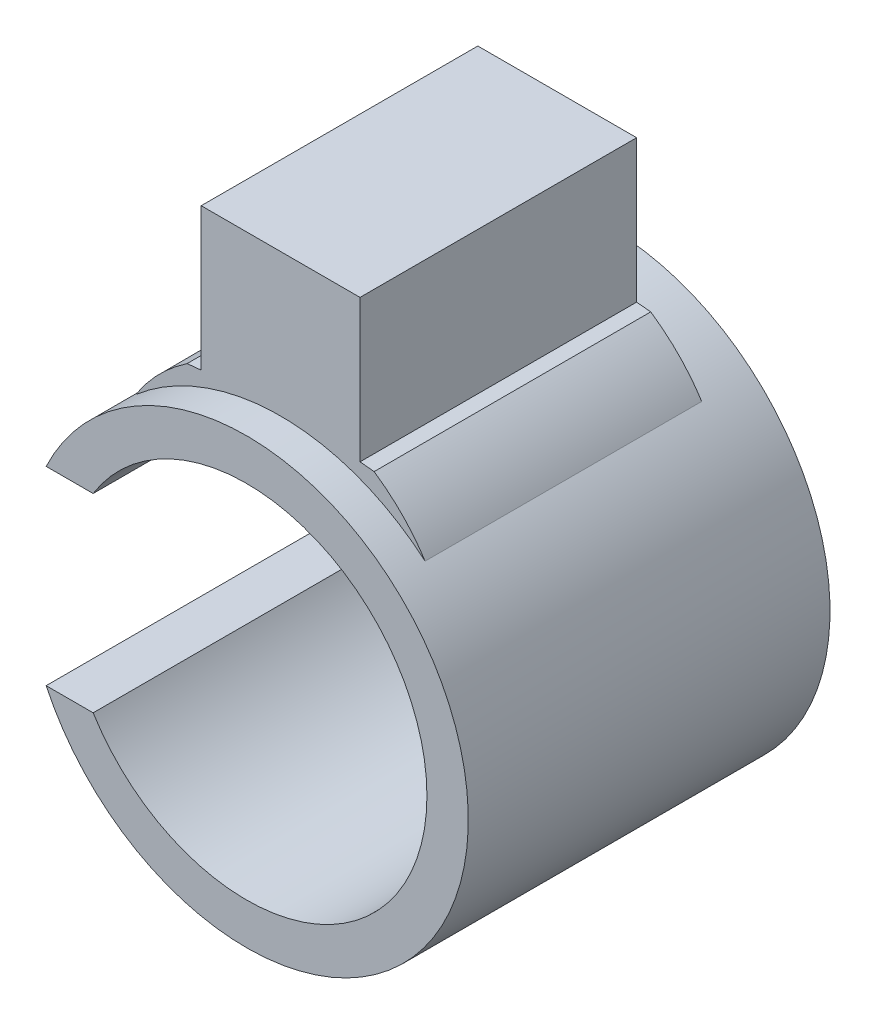
ISO-10303-21;
HEADER;
FILE_DESCRIPTION(('STEP AP214'),'2;1');
FILE_NAME('part.step','',(''),(''),'','','');
FILE_SCHEMA(('AUTOMOTIVE_DESIGN { 1 0 10303 214 1 1 1 1 }'));
ENDSEC;
DATA;
#1=APPLICATION_CONTEXT('core data for automotive mechanical design processes');
#2=APPLICATION_PROTOCOL_DEFINITION('international standard','automotive_design',2000,#1);
#3=PRODUCT_CONTEXT('',#1,'mechanical');
#4=PRODUCT('Part','Part','',(#3));
#5=PRODUCT_RELATED_PRODUCT_CATEGORY('part','',(#4));
#6=PRODUCT_DEFINITION_FORMATION('','',#4);
#7=PRODUCT_DEFINITION_CONTEXT('part definition',#1,'design');
#8=PRODUCT_DEFINITION('design','',#6,#7);
#9=PRODUCT_DEFINITION_SHAPE('','',#8);
#10=(LENGTH_UNIT() NAMED_UNIT(*) SI_UNIT(.MILLI.,.METRE.));
#11=(NAMED_UNIT(*) PLANE_ANGLE_UNIT() SI_UNIT($,.RADIAN.));
#12=(NAMED_UNIT(*) SI_UNIT($,.STERADIAN.) SOLID_ANGLE_UNIT());
#13=UNCERTAINTY_MEASURE_WITH_UNIT(LENGTH_MEASURE(1.E-05),#10,'distance_accuracy_value','');
#14=(GEOMETRIC_REPRESENTATION_CONTEXT(3) GLOBAL_UNCERTAINTY_ASSIGNED_CONTEXT((#13)) GLOBAL_UNIT_ASSIGNED_CONTEXT((#10,
#11,#12)) REPRESENTATION_CONTEXT('',''));
#15=CARTESIAN_POINT('',(0.,0.,0.));
#16=DIRECTION('',(0.,0.,1.));
#17=DIRECTION('',(1.,0.,0.));
#18=AXIS2_PLACEMENT_3D('',#15,#16,#17);
#19=CARTESIAN_POINT('',(0.,0.,-53.));
#20=DIRECTION('',(0.,0.,1.));
#21=DIRECTION('',(1.,0.,0.));
#22=AXIS2_PLACEMENT_3D('',#19,#20,#21);
#23=CYLINDRICAL_SURFACE('',#22,23.3557094180921);
#24=DIRECTION('',(0.,0.,-1.));
#25=VECTOR('',#24,1.);
#26=CARTESIAN_POINT('',(-15.2157622327974,17.7191913499835,-5.36257568087237));
#27=LINE('',#26,#25);
#28=CARTESIAN_POINT('',(-15.2157622327974,17.7191913499835,-21.5887815299654));
#29=VERTEX_POINT('',#28);
#30=CARTESIAN_POINT('',(-15.2157622327974,17.7191913499835,-50.7213614420877));
#31=VERTEX_POINT('',#30);
#32=EDGE_CURVE('E219',#29,#31,#27,.T.);
#33=ORIENTED_EDGE('',*,*,#32,.T.);
#34=CARTESIAN_POINT('',(0.,0.,-50.7213614420877));
#35=DIRECTION('',(0.,0.,-1.));
#36=DIRECTION('',(-1.,0.,0.));
#37=AXIS2_PLACEMENT_3D('',#34,#35,#36);
#38=CIRCLE('',#37,23.3557094180921);
#39=CARTESIAN_POINT('',(15.2157622327974,17.7191913499835,-50.7213614420877));
#40=VERTEX_POINT('',#39);
#41=EDGE_CURVE('E102',#31,#40,#38,.T.);
#42=ORIENTED_EDGE('',*,*,#41,.T.);
#43=DIRECTION('',(0.,0.,-1.));
#44=VECTOR('',#43,1.);
#45=CARTESIAN_POINT('',(15.2157622327974,17.7191913499835,-5.36257568087237));
#46=LINE('',#45,#44);
#47=CARTESIAN_POINT('',(15.2157622327974,17.7191913499835,-21.5887815299654));
#48=VERTEX_POINT('',#47);
#49=EDGE_CURVE('E299',#48,#40,#46,.T.);
#50=ORIENTED_EDGE('',*,*,#49,.F.);
#51=CARTESIAN_POINT('',(0.,0.,-21.5887815299654));
#52=DIRECTION('',(0.,0.,-1.));
#53=DIRECTION('',(-1.,0.,0.));
#54=AXIS2_PLACEMENT_3D('',#51,#52,#53);
#55=CIRCLE('',#54,23.3557094180921);
#56=EDGE_CURVE('E298',#48,#29,#55,.F.);
#57=ORIENTED_EDGE('',*,*,#56,.T.);
#58=EDGE_LOOP('',(#33,#42,#50,#57));
#59=FACE_BOUND('',#58,.T.);
#60=CARTESIAN_POINT('',(0.,0.,-18.));
#61=DIRECTION('',(0.,0.,1.));
#62=DIRECTION('',(1.,0.,0.));
#63=AXIS2_PLACEMENT_3D('',#60,#61,#62);
#64=CIRCLE('',#63,23.3557094180921);
#65=CARTESIAN_POINT('',(-21.1066141866087,-10.,-18.));
#66=VERTEX_POINT('',#65);
#67=CARTESIAN_POINT('',(-21.1066141866087,10.,-18.));
#68=VERTEX_POINT('',#67);
#69=EDGE_CURVE('E317',#66,#68,#64,.T.);
#70=ORIENTED_EDGE('',*,*,#69,.F.);
#71=DIRECTION('',(0.,0.,1.));
#72=VECTOR('',#71,1.);
#73=CARTESIAN_POINT('',(-21.1066141866087,-10.,-56.0968163326382));
#74=LINE('',#73,#72);
#75=CARTESIAN_POINT('',(-21.1066141866087,-10.,-56.0968163326382));
#76=VERTEX_POINT('',#75);
#77=EDGE_CURVE('E207',#76,#66,#74,.T.);
#78=ORIENTED_EDGE('',*,*,#77,.F.);
#79=CARTESIAN_POINT('',(0.,0.,-56.0968163326382));
#80=DIRECTION('',(0.,0.,1.));
#81=DIRECTION('',(1.,0.,0.));
#82=AXIS2_PLACEMENT_3D('',#79,#80,#81);
#83=CIRCLE('',#82,23.3557094180921);
#84=CARTESIAN_POINT('',(-21.1066141866087,10.,-56.0968163326382));
#85=VERTEX_POINT('',#84);
#86=EDGE_CURVE('E328',#76,#85,#83,.T.);
#87=ORIENTED_EDGE('',*,*,#86,.T.);
#88=DIRECTION('',(0.,0.,1.));
#89=VECTOR('',#88,1.);
#90=CARTESIAN_POINT('',(-21.1066141866087,10.,-56.0968163326382));
#91=LINE('',#90,#89);
#92=EDGE_CURVE('E184',#85,#68,#91,.T.);
#93=ORIENTED_EDGE('',*,*,#92,.T.);
#94=EDGE_LOOP('',(#70,#78,#87,#93));
#95=FACE_BOUND('',#94,.T.);
#96=ADVANCED_FACE('F79',(#59,#95),#23,.T.);
#97=CARTESIAN_POINT('',(0.,23.3557094180921,-56.0968163326382));
#98=DIRECTION('',(0.,0.,1.));
#99=DIRECTION('',(1.,0.,0.));
#100=AXIS2_PLACEMENT_3D('',#97,#98,#99);
#101=PLANE('',#100);
#102=CARTESIAN_POINT('',(0.,0.,-56.0968163326382));
#103=DIRECTION('',(0.,0.,-1.));
#104=DIRECTION('',(-1.,0.,0.));
#105=AXIS2_PLACEMENT_3D('',#102,#103,#104);
#106=CIRCLE('',#105,7.69210004054701);
#107=CARTESIAN_POINT('',(-7.69210004054701,0.,-56.0968163326382));
#108=VERTEX_POINT('',#107);
#109=EDGE_CURVE('E309',#108,#108,#106,.T.);
#110=ORIENTED_EDGE('',*,*,#109,.F.);
#111=EDGE_LOOP('',(#110));
#112=FACE_BOUND('',#111,.T.);
#113=ORIENTED_EDGE('',*,*,#86,.F.);
#114=DIRECTION('',(1.,0.,0.));
#115=VECTOR('',#114,1.);
#116=CARTESIAN_POINT('',(-16.1554944214035,-10.,-56.0968163326382));
#117=LINE('',#116,#115);
#118=CARTESIAN_POINT('',(-16.1554944214035,-10.,-56.0968163326382));
#119=VERTEX_POINT('',#118);
#120=EDGE_CURVE('E194',#76,#119,#117,.T.);
#121=ORIENTED_EDGE('',*,*,#120,.T.);
#122=CARTESIAN_POINT('',(0.,0.,-56.0968163326382));
#123=DIRECTION('',(0.,0.,-1.));
#124=DIRECTION('',(1.,0.,0.));
#125=AXIS2_PLACEMENT_3D('',#122,#123,#124);
#126=CIRCLE('',#125,19.);
#127=CARTESIAN_POINT('',(-16.1554944214035,10.,-56.0968163326382));
#128=VERTEX_POINT('',#127);
#129=EDGE_CURVE('E179',#119,#128,#126,.T.);
#130=ORIENTED_EDGE('',*,*,#129,.T.);
#131=DIRECTION('',(-1.,0.,0.));
#132=VECTOR('',#131,1.);
#133=CARTESIAN_POINT('',(-16.1554944214035,10.,-56.0968163326382));
#134=LINE('',#133,#132);
#135=EDGE_CURVE('E187',#128,#85,#134,.T.);
#136=ORIENTED_EDGE('',*,*,#135,.T.);
#137=EDGE_LOOP('',(#113,#121,#130,#136));
#138=FACE_BOUND('',#137,.T.);
#139=ADVANCED_FACE('F196',(#112,#138),#101,.F.);
#140=CARTESIAN_POINT('',(0.,19.,-53.));
#141=DIRECTION('',(0.,0.,-1.));
#142=DIRECTION('',(-1.,0.,0.));
#143=AXIS2_PLACEMENT_3D('',#140,#141,#142);
#144=PLANE('',#143);
#145=CARTESIAN_POINT('',(0.,0.,-53.));
#146=DIRECTION('',(0.,0.,-1.));
#147=DIRECTION('',(-1.,0.,0.));
#148=AXIS2_PLACEMENT_3D('',#145,#146,#147);
#149=CIRCLE('',#148,7.69210004054701);
#150=CARTESIAN_POINT('',(-7.69210004054701,0.,-53.));
#151=VERTEX_POINT('',#150);
#152=EDGE_CURVE('E316',#151,#151,#149,.T.);
#153=ORIENTED_EDGE('',*,*,#152,.T.);
#154=EDGE_LOOP('',(#153));
#155=FACE_BOUND('',#154,.T.);
#156=CARTESIAN_POINT('',(0.,0.,-53.));
#157=DIRECTION('',(0.,0.,1.));
#158=DIRECTION('',(1.,0.,0.));
#159=AXIS2_PLACEMENT_3D('',#156,#157,#158);
#160=CIRCLE('',#159,19.);
#161=CARTESIAN_POINT('',(-16.1554944214035,10.,-53.));
#162=VERTEX_POINT('',#161);
#163=CARTESIAN_POINT('',(-16.1554944214035,-10.,-53.));
#164=VERTEX_POINT('',#163);
#165=EDGE_CURVE('E182',#162,#164,#160,.T.);
#166=ORIENTED_EDGE('',*,*,#165,.T.);
#167=EDGE_CURVE('E325',#164,#162,#160,.T.);
#168=ORIENTED_EDGE('',*,*,#167,.T.);
#169=EDGE_LOOP('',(#166,#168));
#170=FACE_BOUND('',#169,.T.);
#171=ADVANCED_FACE('F395',(#155,#170),#144,.F.);
#172=CARTESIAN_POINT('',(0.,0.,-53.));
#173=DIRECTION('',(0.,0.,1.));
#174=DIRECTION('',(1.,0.,0.));
#175=AXIS2_PLACEMENT_3D('',#172,#173,#174);
#176=CYLINDRICAL_SURFACE('',#175,19.);
#177=ORIENTED_EDGE('',*,*,#167,.F.);
#178=DIRECTION('',(0.,0.,1.));
#179=VECTOR('',#178,1.);
#180=CARTESIAN_POINT('',(-16.1554944214035,-10.,-56.0968163326382));
#181=LINE('',#180,#179);
#182=CARTESIAN_POINT('',(-16.1554944214035,-10.,-18.));
#183=VERTEX_POINT('',#182);
#184=EDGE_CURVE('E206',#164,#183,#181,.T.);
#185=ORIENTED_EDGE('',*,*,#184,.T.);
#186=CARTESIAN_POINT('',(0.,0.,-18.));
#187=DIRECTION('',(0.,0.,1.));
#188=DIRECTION('',(1.,0.,0.));
#189=AXIS2_PLACEMENT_3D('',#186,#187,#188);
#190=CIRCLE('',#189,19.);
#191=CARTESIAN_POINT('',(-16.1554944214035,10.,-18.));
#192=VERTEX_POINT('',#191);
#193=EDGE_CURVE('E321',#183,#192,#190,.T.);
#194=ORIENTED_EDGE('',*,*,#193,.T.);
#195=DIRECTION('',(0.,0.,1.));
#196=VECTOR('',#195,1.);
#197=CARTESIAN_POINT('',(-16.1554944214035,10.,-56.0968163326382));
#198=LINE('',#197,#196);
#199=EDGE_CURVE('E94',#162,#192,#198,.T.);
#200=ORIENTED_EDGE('',*,*,#199,.F.);
#201=EDGE_LOOP('',(#177,#185,#194,#200));
#202=FACE_BOUND('',#201,.T.);
#203=ADVANCED_FACE('F341',(#202),#176,.F.);
#204=CARTESIAN_POINT('',(0.,19.,-18.));
#205=DIRECTION('',(0.,0.,-1.));
#206=DIRECTION('',(-1.,0.,0.));
#207=AXIS2_PLACEMENT_3D('',#204,#205,#206);
#208=PLANE('',#207);
#209=ORIENTED_EDGE('',*,*,#193,.F.);
#210=DIRECTION('',(-1.,0.,0.));
#211=VECTOR('',#210,1.);
#212=CARTESIAN_POINT('',(0.,-9.99999999999999,-18.));
#213=LINE('',#212,#211);
#214=EDGE_CURVE('E12',#183,#66,#213,.T.);
#215=ORIENTED_EDGE('',*,*,#214,.T.);
#216=ORIENTED_EDGE('',*,*,#69,.T.);
#217=DIRECTION('',(1.,0.,0.));
#218=VECTOR('',#217,1.);
#219=CARTESIAN_POINT('',(0.,10.,-18.));
#220=LINE('',#219,#218);
#221=EDGE_CURVE('E87',#68,#192,#220,.T.);
#222=ORIENTED_EDGE('',*,*,#221,.T.);
#223=EDGE_LOOP('',(#209,#215,#216,#222));
#224=FACE_BOUND('',#223,.T.);
#225=ADVANCED_FACE('F336',(#224),#208,.F.);
#226=CARTESIAN_POINT('',(0.,0.,-46.0968163326382));
#227=DIRECTION('',(0.,0.,-1.));
#228=DIRECTION('',(-1.,0.,0.));
#229=AXIS2_PLACEMENT_3D('',#226,#227,#228);
#230=CYLINDRICAL_SURFACE('',#229,7.69210004054701);
#231=ORIENTED_EDGE('',*,*,#109,.T.);
#232=EDGE_LOOP('',(#231));
#233=FACE_BOUND('',#232,.T.);
#234=ORIENTED_EDGE('',*,*,#152,.F.);
#235=EDGE_LOOP('',(#234));
#236=FACE_BOUND('',#235,.T.);
#237=ADVANCED_FACE('F444',(#233,#236),#230,.F.);
#238=CARTESIAN_POINT('',(2.32398983291346,23.9418915673897,-5.36257568087237));
#239=DIRECTION('',(-0.0966138395780347,-0.995321940882441,0.));
#240=DIRECTION('',(0.995321940882441,-0.0966138395780347,0.));
#241=AXIS2_PLACEMENT_3D('',#238,#239,#240);
#242=PLANE('',#241);
#243=DIRECTION('',(0.,0.,-1.));
#244=VECTOR('',#243,1.);
#245=CARTESIAN_POINT('',(8.36287574302456,23.3557094180921,-5.36257568087237));
#246=LINE('',#245,#244);
#247=CARTESIAN_POINT('',(8.36287574302456,23.3557094180921,-21.5887815299654));
#248=VERTEX_POINT('',#247);
#249=CARTESIAN_POINT('',(8.36287574302456,23.3557094180921,-50.7213614420877));
#250=VERTEX_POINT('',#249);
#251=EDGE_CURVE('E294',#248,#250,#246,.T.);
#252=ORIENTED_EDGE('',*,*,#251,.F.);
#253=DIRECTION('',(0.995321940882441,-0.0966138395780347,0.));
#254=VECTOR('',#253,1.);
#255=CARTESIAN_POINT('',(2.32398983291346,23.9418915673897,-21.5887815299654));
#256=LINE('',#255,#254);
#257=CARTESIAN_POINT('',(9.85069403878302,23.2112899772625,-21.5887815299654));
#258=VERTEX_POINT('',#257);
#259=EDGE_CURVE('E273',#248,#258,#256,.T.);
#260=ORIENTED_EDGE('',*,*,#259,.T.);
#261=DIRECTION('',(0.,0.,-1.));
#262=VECTOR('',#261,1.);
#263=CARTESIAN_POINT('',(9.85069403878302,23.2112899772625,-5.36257568087237));
#264=LINE('',#263,#262);
#265=CARTESIAN_POINT('',(9.85069403878302,23.2112899772625,-50.7213614420877));
#266=VERTEX_POINT('',#265);
#267=EDGE_CURVE('E293',#258,#266,#264,.T.);
#268=ORIENTED_EDGE('',*,*,#267,.T.);
#269=DIRECTION('',(-0.995321940882441,0.0966138395780347,0.));
#270=VECTOR('',#269,1.);
#271=CARTESIAN_POINT('',(2.32398983291346,23.9418915673897,-50.7213614420877));
#272=LINE('',#271,#270);
#273=EDGE_CURVE('E275',#266,#250,#272,.T.);
#274=ORIENTED_EDGE('',*,*,#273,.T.);
#275=EDGE_LOOP('',(#252,#260,#268,#274));
#276=FACE_BOUND('',#275,.T.);
#277=ADVANCED_FACE('F265',(#276),#242,.F.);
#278=CARTESIAN_POINT('',(9.85069403878302,23.2112899772625,-5.36257568087237));
#279=CARTESIAN_POINT('',(13.1768632570425,20.9459114759131,-5.36257568087237));
#280=CARTESIAN_POINT('',(15.2157622327974,17.7191913499835,-5.36257568087237));
#281=B_SPLINE_CURVE_WITH_KNOTS('',2,(#278,#279,#280),.UNSPECIFIED.,.F.,.F.,(3,3),(0.,
0.793491279438792),.UNSPECIFIED.);
#282=DIRECTION('',(0.,0.,-1.));
#283=VECTOR('',#282,1.);
#284=SURFACE_OF_LINEAR_EXTRUSION('',#281,#283);
#285=CARTESIAN_POINT('',(9.85069403878302,23.2112899772625,-21.5887815299654));
#286=CARTESIAN_POINT('',(13.1768632570425,20.9459114759131,-21.5887815299654));
#287=CARTESIAN_POINT('',(15.2157622327974,17.7191913499835,-21.5887815299654));
#288=B_SPLINE_CURVE_WITH_KNOTS('',2,(#285,#286,#287),.UNSPECIFIED.,.F.,.F.,(3,3),(0.,
0.793491279438792),.UNSPECIFIED.);
#289=EDGE_CURVE('E304',#48,#258,#288,.F.);
#290=ORIENTED_EDGE('',*,*,#289,.F.);
#291=ORIENTED_EDGE('',*,*,#49,.T.);
#292=CARTESIAN_POINT('',(9.85069403878302,23.2112899772625,-50.7213614420877));
#293=CARTESIAN_POINT('',(13.1768632570425,20.9459114759131,-50.7213614420877));
#294=CARTESIAN_POINT('',(15.2157622327974,17.7191913499835,-50.7213614420877));
#295=B_SPLINE_CURVE_WITH_KNOTS('',2,(#292,#293,#294),.UNSPECIFIED.,.F.,.F.,(3,3),(0.,
0.793491279438792),.UNSPECIFIED.);
#296=EDGE_CURVE('E281',#266,#40,#295,.T.);
#297=ORIENTED_EDGE('',*,*,#296,.F.);
#298=ORIENTED_EDGE('',*,*,#267,.F.);
#299=EDGE_LOOP('',(#290,#291,#297,#298));
#300=FACE_BOUND('',#299,.T.);
#301=ADVANCED_FACE('F260',(#300),#284,.T.);
#302=CARTESIAN_POINT('',(0.,0.,-50.7213614420877));
#303=DIRECTION('',(0.,0.,-1.));
#304=DIRECTION('',(-1.,0.,0.));
#305=AXIS2_PLACEMENT_3D('',#302,#303,#304);
#306=PLANE('',#305);
#307=ORIENTED_EDGE('',*,*,#273,.F.);
#308=ORIENTED_EDGE('',*,*,#296,.T.);
#309=ORIENTED_EDGE('',*,*,#41,.F.);
#310=CARTESIAN_POINT('',(-9.85069403878302,23.2112899772625,-50.7213614420877));
#311=CARTESIAN_POINT('',(-13.1768632570425,20.9459114759131,-50.7213614420877));
#312=CARTESIAN_POINT('',(-15.2157622327974,17.7191913499835,-50.7213614420877));
#313=B_SPLINE_CURVE_WITH_KNOTS('',2,(#310,#311,#312),.UNSPECIFIED.,.F.,.F.,(3,3),(0.,
0.793491279438792),.UNSPECIFIED.);
#314=CARTESIAN_POINT('',(-9.85069403878302,23.2112899772625,-50.7213614420877));
#315=VERTEX_POINT('',#314);
#316=EDGE_CURVE('E205',#315,#31,#313,.T.);
#317=ORIENTED_EDGE('',*,*,#316,.F.);
#318=DIRECTION('',(0.995321940882441,0.0966138395780347,0.));
#319=VECTOR('',#318,1.);
#320=CARTESIAN_POINT('',(-2.32398983291346,23.9418915673897,-50.7213614420877));
#321=LINE('',#320,#319);
#322=CARTESIAN_POINT('',(-8.36287574302456,23.3557094180921,-50.7213614420877));
#323=VERTEX_POINT('',#322);
#324=EDGE_CURVE('E349',#315,#323,#321,.T.);
#325=ORIENTED_EDGE('',*,*,#324,.T.);
#326=DIRECTION('',(0.,-1.,0.));
#327=VECTOR('',#326,1.);
#328=CARTESIAN_POINT('',(-8.36287574302456,38.355709418092,-50.7213614420877));
#329=LINE('',#328,#327);
#330=CARTESIAN_POINT('',(-8.36287574302456,38.355709418092,-50.7213614420877));
#331=VERTEX_POINT('',#330);
#332=EDGE_CURVE('E375',#331,#323,#329,.T.);
#333=ORIENTED_EDGE('',*,*,#332,.F.);
#334=DIRECTION('',(-1.,0.,0.));
#335=VECTOR('',#334,1.);
#336=CARTESIAN_POINT('',(8.36287574302456,38.355709418092,-50.7213614420877));
#337=LINE('',#336,#335);
#338=CARTESIAN_POINT('',(8.36287574302456,38.355709418092,-50.7213614420877));
#339=VERTEX_POINT('',#338);
#340=EDGE_CURVE('E372',#339,#331,#337,.T.);
#341=ORIENTED_EDGE('',*,*,#340,.F.);
#342=DIRECTION('',(0.,-1.,0.));
#343=VECTOR('',#342,1.);
#344=CARTESIAN_POINT('',(8.36287574302456,38.355709418092,-50.7213614420877));
#345=LINE('',#344,#343);
#346=EDGE_CURVE('E379',#339,#250,#345,.T.);
#347=ORIENTED_EDGE('',*,*,#346,.T.);
#348=EDGE_LOOP('',(#307,#308,#309,#317,#325,#333,#341,#347));
#349=FACE_BOUND('',#348,.T.);
#350=ADVANCED_FACE('F256',(#349),#306,.T.);
#351=CARTESIAN_POINT('',(8.36287574302456,38.355709418092,-21.5887815299654));
#352=DIRECTION('',(0.,0.,-1.));
#353=DIRECTION('',(-1.,0.,0.));
#354=AXIS2_PLACEMENT_3D('',#351,#352,#353);
#355=PLANE('',#354);
#356=ORIENTED_EDGE('',*,*,#259,.F.);
#357=DIRECTION('',(0.,-1.,0.));
#358=VECTOR('',#357,1.);
#359=CARTESIAN_POINT('',(8.36287574302456,38.355709418092,-21.5887815299654));
#360=LINE('',#359,#358);
#361=CARTESIAN_POINT('',(8.36287574302456,38.355709418092,-21.5887815299654));
#362=VERTEX_POINT('',#361);
#363=EDGE_CURVE('E383',#362,#248,#360,.T.);
#364=ORIENTED_EDGE('',*,*,#363,.F.);
#365=DIRECTION('',(1.,0.,0.));
#366=VECTOR('',#365,1.);
#367=CARTESIAN_POINT('',(8.36287574302456,38.355709418092,-21.5887815299654));
#368=LINE('',#367,#366);
#369=CARTESIAN_POINT('',(-8.36287574302456,38.355709418092,-21.5887815299654));
#370=VERTEX_POINT('',#369);
#371=EDGE_CURVE('E366',#370,#362,#368,.T.);
#372=ORIENTED_EDGE('',*,*,#371,.F.);
#373=DIRECTION('',(0.,-1.,0.));
#374=VECTOR('',#373,1.);
#375=CARTESIAN_POINT('',(-8.36287574302456,38.355709418092,-21.5887815299654));
#376=LINE('',#375,#374);
#377=CARTESIAN_POINT('',(-8.36287574302456,23.3557094180921,-21.5887815299654));
#378=VERTEX_POINT('',#377);
#379=EDGE_CURVE('E282',#370,#378,#376,.T.);
#380=ORIENTED_EDGE('',*,*,#379,.T.);
#381=DIRECTION('',(-0.995321940882441,-0.0966138395780347,0.));
#382=VECTOR('',#381,1.);
#383=CARTESIAN_POINT('',(-2.32398983291346,23.9418915673897,-21.5887815299654));
#384=LINE('',#383,#382);
#385=CARTESIAN_POINT('',(-9.85069403878302,23.2112899772625,-21.5887815299654));
#386=VERTEX_POINT('',#385);
#387=EDGE_CURVE('E218',#378,#386,#384,.T.);
#388=ORIENTED_EDGE('',*,*,#387,.T.);
#389=CARTESIAN_POINT('',(-9.85069403878302,23.2112899772625,-21.5887815299654));
#390=CARTESIAN_POINT('',(-13.1768632570425,20.9459114759131,-21.5887815299654));
#391=CARTESIAN_POINT('',(-15.2157622327974,17.7191913499835,-21.5887815299654));
#392=B_SPLINE_CURVE_WITH_KNOTS('',2,(#389,#390,#391),.UNSPECIFIED.,.F.,.F.,(3,3),(0.,
0.793491279438792),.UNSPECIFIED.);
#393=EDGE_CURVE('E212',#29,#386,#392,.F.);
#394=ORIENTED_EDGE('',*,*,#393,.F.);
#395=ORIENTED_EDGE('',*,*,#56,.F.);
#396=ORIENTED_EDGE('',*,*,#289,.T.);
#397=EDGE_LOOP('',(#356,#364,#372,#380,#388,#394,#395,#396));
#398=FACE_BOUND('',#397,.T.);
#399=ADVANCED_FACE('F252',(#398),#355,.F.);
#400=CARTESIAN_POINT('',(-8.36287574302456,38.355709418092,-50.7213614420877));
#401=DIRECTION('',(1.,0.,0.));
#402=DIRECTION('',(0.,0.,-1.));
#403=AXIS2_PLACEMENT_3D('',#400,#401,#402);
#404=PLANE('',#403);
#405=DIRECTION('',(0.,0.,1.));
#406=VECTOR('',#405,1.);
#407=CARTESIAN_POINT('',(-8.36287574302456,23.3557094180921,-50.7213614420877));
#408=LINE('',#407,#406);
#409=EDGE_CURVE('E358',#323,#378,#408,.T.);
#410=ORIENTED_EDGE('',*,*,#409,.T.);
#411=ORIENTED_EDGE('',*,*,#379,.F.);
#412=DIRECTION('',(0.,0.,1.));
#413=VECTOR('',#412,1.);
#414=CARTESIAN_POINT('',(-8.36287574302456,38.355709418092,-50.7213614420877));
#415=LINE('',#414,#413);
#416=EDGE_CURVE('E362',#331,#370,#415,.T.);
#417=ORIENTED_EDGE('',*,*,#416,.F.);
#418=ORIENTED_EDGE('',*,*,#332,.T.);
#419=EDGE_LOOP('',(#410,#411,#417,#418));
#420=FACE_BOUND('',#419,.T.);
#421=ADVANCED_FACE('F248',(#420),#404,.F.);
#422=CARTESIAN_POINT('',(8.36287574302456,38.355709418092,-50.7213614420877));
#423=DIRECTION('',(-1.,0.,0.));
#424=DIRECTION('',(0.,0.,1.));
#425=AXIS2_PLACEMENT_3D('',#422,#423,#424);
#426=PLANE('',#425);
#427=ORIENTED_EDGE('',*,*,#251,.T.);
#428=ORIENTED_EDGE('',*,*,#346,.F.);
#429=DIRECTION('',(0.,0.,-1.));
#430=VECTOR('',#429,1.);
#431=CARTESIAN_POINT('',(8.36287574302456,38.355709418092,-50.7213614420877));
#432=LINE('',#431,#430);
#433=EDGE_CURVE('E369',#362,#339,#432,.T.);
#434=ORIENTED_EDGE('',*,*,#433,.F.);
#435=ORIENTED_EDGE('',*,*,#363,.T.);
#436=EDGE_LOOP('',(#427,#428,#434,#435));
#437=FACE_BOUND('',#436,.T.);
#438=ADVANCED_FACE('F244',(#437),#426,.F.);
#439=CARTESIAN_POINT('',(0.,38.355709418092,0.));
#440=DIRECTION('',(0.,-1.,0.));
#441=DIRECTION('',(0.,0.,-1.));
#442=AXIS2_PLACEMENT_3D('',#439,#440,#441);
#443=PLANE('',#442);
#444=ORIENTED_EDGE('',*,*,#416,.T.);
#445=ORIENTED_EDGE('',*,*,#371,.T.);
#446=ORIENTED_EDGE('',*,*,#433,.T.);
#447=ORIENTED_EDGE('',*,*,#340,.T.);
#448=EDGE_LOOP('',(#444,#445,#446,#447));
#449=FACE_BOUND('',#448,.T.);
#450=ADVANCED_FACE('F239',(#449),#443,.F.);
#451=CARTESIAN_POINT('',(-9.85069403878302,23.2112899772625,-5.36257568087237));
#452=CARTESIAN_POINT('',(-13.1768632570425,20.9459114759131,-5.36257568087237));
#453=CARTESIAN_POINT('',(-15.2157622327974,17.7191913499835,-5.36257568087237));
#454=B_SPLINE_CURVE_WITH_KNOTS('',2,(#451,#452,#453),.UNSPECIFIED.,.F.,.F.,(3,3),(0.,
0.793491279438792),.UNSPECIFIED.);
#455=DIRECTION('',(0.,0.,-1.));
#456=VECTOR('',#455,1.);
#457=SURFACE_OF_LINEAR_EXTRUSION('',#454,#456);
#458=ORIENTED_EDGE('',*,*,#32,.F.);
#459=ORIENTED_EDGE('',*,*,#393,.T.);
#460=DIRECTION('',(0.,0.,-1.));
#461=VECTOR('',#460,1.);
#462=CARTESIAN_POINT('',(-9.85069403878302,23.2112899772625,-5.36257568087237));
#463=LINE('',#462,#461);
#464=EDGE_CURVE('E352',#386,#315,#463,.T.);
#465=ORIENTED_EDGE('',*,*,#464,.T.);
#466=ORIENTED_EDGE('',*,*,#316,.T.);
#467=EDGE_LOOP('',(#458,#459,#465,#466));
#468=FACE_BOUND('',#467,.T.);
#469=ADVANCED_FACE('F234',(#468),#457,.F.);
#470=CARTESIAN_POINT('',(-2.32398983291346,23.9418915673897,-5.36257568087237));
#471=DIRECTION('',(-0.0966138395780347,0.995321940882441,0.));
#472=DIRECTION('',(-0.995321940882441,-0.0966138395780347,0.));
#473=AXIS2_PLACEMENT_3D('',#470,#471,#472);
#474=PLANE('',#473);
#475=ORIENTED_EDGE('',*,*,#387,.F.);
#476=ORIENTED_EDGE('',*,*,#409,.F.);
#477=ORIENTED_EDGE('',*,*,#324,.F.);
#478=ORIENTED_EDGE('',*,*,#464,.F.);
#479=EDGE_LOOP('',(#475,#476,#477,#478));
#480=FACE_BOUND('',#479,.T.);
#481=ADVANCED_FACE('F238',(#480),#474,.T.);
#482=CARTESIAN_POINT('',(0.,0.,-56.0968163326382));
#483=DIRECTION('',(0.,0.,1.));
#484=DIRECTION('',(1.,0.,0.));
#485=AXIS2_PLACEMENT_3D('',#482,#483,#484);
#486=CYLINDRICAL_SURFACE('',#485,19.);
#487=EDGE_CURVE('E174',#128,#162,#198,.T.);
#488=ORIENTED_EDGE('',*,*,#487,.F.);
#489=ORIENTED_EDGE('',*,*,#129,.F.);
#490=EDGE_CURVE('E202',#119,#164,#181,.T.);
#491=ORIENTED_EDGE('',*,*,#490,.T.);
#492=ORIENTED_EDGE('',*,*,#165,.F.);
#493=EDGE_LOOP('',(#488,#489,#491,#492));
#494=FACE_BOUND('',#493,.T.);
#495=ADVANCED_FACE('F176',(#494),#486,.T.);
#496=CARTESIAN_POINT('',(-16.1554944214035,-10.,-56.0968163326382));
#497=DIRECTION('',(0.,-1.,0.));
#498=DIRECTION('',(1.,0.,0.));
#499=AXIS2_PLACEMENT_3D('',#496,#497,#498);
#500=PLANE('',#499);
#501=ORIENTED_EDGE('',*,*,#184,.F.);
#502=ORIENTED_EDGE('',*,*,#490,.F.);
#503=ORIENTED_EDGE('',*,*,#120,.F.);
#504=ORIENTED_EDGE('',*,*,#77,.T.);
#505=ORIENTED_EDGE('',*,*,#214,.F.);
#506=EDGE_LOOP('',(#501,#502,#503,#504,#505));
#507=FACE_BOUND('',#506,.T.);
#508=ADVANCED_FACE('F411',(#507),#500,.F.);
#509=CARTESIAN_POINT('',(-16.1554944214035,10.,-56.0968163326382));
#510=DIRECTION('',(0.,1.,0.));
#511=DIRECTION('',(0.,0.,1.));
#512=AXIS2_PLACEMENT_3D('',#509,#510,#511);
#513=PLANE('',#512);
#514=ORIENTED_EDGE('',*,*,#92,.F.);
#515=ORIENTED_EDGE('',*,*,#135,.F.);
#516=ORIENTED_EDGE('',*,*,#487,.T.);
#517=ORIENTED_EDGE('',*,*,#199,.T.);
#518=ORIENTED_EDGE('',*,*,#221,.F.);
#519=EDGE_LOOP('',(#514,#515,#516,#517,#518));
#520=FACE_BOUND('',#519,.T.);
#521=ADVANCED_FACE('F188',(#520),#513,.F.);
#522=CLOSED_SHELL('',(#96,#139,#171,#203,#225,#237,#277,#301,#350,#399,#421,#438,#450,#469,#481,
#495,#508,#521));
#523=MANIFOLD_SOLID_BREP('B2',#522);
#524=ADVANCED_BREP_SHAPE_REPRESENTATION('',(#18,#523),#14);
#525=SHAPE_DEFINITION_REPRESENTATION(#9,#524);
ENDSEC;
END-ISO-10303-21;
